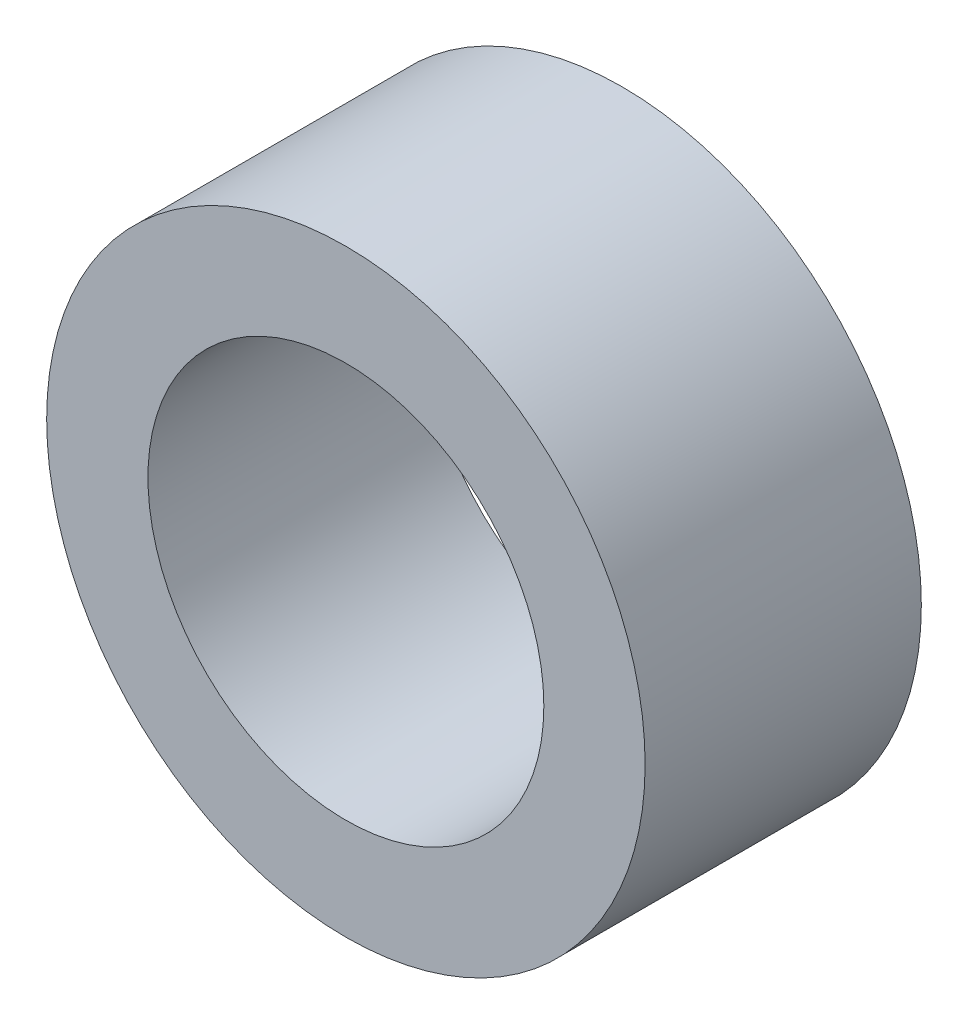
ISO-10303-21;
HEADER;
FILE_DESCRIPTION(('STEP AP214'),'2;1');
FILE_NAME('part.step','',(''),(''),'','','');
FILE_SCHEMA(('AUTOMOTIVE_DESIGN { 1 0 10303 214 1 1 1 1 }'));
ENDSEC;
DATA;
#1=APPLICATION_CONTEXT('core data for automotive mechanical design processes');
#2=APPLICATION_PROTOCOL_DEFINITION('international standard','automotive_design',2000,#1);
#3=PRODUCT_CONTEXT('',#1,'mechanical');
#4=PRODUCT('Part','Part','',(#3));
#5=PRODUCT_RELATED_PRODUCT_CATEGORY('part','',(#4));
#6=PRODUCT_DEFINITION_FORMATION('','',#4);
#7=PRODUCT_DEFINITION_CONTEXT('part definition',#1,'design');
#8=PRODUCT_DEFINITION('design','',#6,#7);
#9=PRODUCT_DEFINITION_SHAPE('','',#8);
#10=(LENGTH_UNIT() NAMED_UNIT(*) SI_UNIT(.MILLI.,.METRE.));
#11=(NAMED_UNIT(*) PLANE_ANGLE_UNIT() SI_UNIT($,.RADIAN.));
#12=(NAMED_UNIT(*) SI_UNIT($,.STERADIAN.) SOLID_ANGLE_UNIT());
#13=UNCERTAINTY_MEASURE_WITH_UNIT(LENGTH_MEASURE(1.E-05),#10,'distance_accuracy_value','');
#14=(GEOMETRIC_REPRESENTATION_CONTEXT(3) GLOBAL_UNCERTAINTY_ASSIGNED_CONTEXT((#13)) GLOBAL_UNIT_ASSIGNED_CONTEXT((#10,
#11,#12)) REPRESENTATION_CONTEXT('',''));
#15=CARTESIAN_POINT('',(0.,0.,0.));
#16=DIRECTION('',(0.,0.,1.));
#17=DIRECTION('',(1.,0.,0.));
#18=AXIS2_PLACEMENT_3D('',#15,#16,#17);
#19=CARTESIAN_POINT('',(0.,0.,3.));
#20=DIRECTION('',(0.,0.,1.));
#21=DIRECTION('',(1.,0.,0.));
#22=AXIS2_PLACEMENT_3D('',#19,#20,#21);
#23=PLANE('',#22);
#24=CARTESIAN_POINT('',(0.,0.,3.));
#25=DIRECTION('',(0.,0.,1.));
#26=DIRECTION('',(1.,0.,0.));
#27=AXIS2_PLACEMENT_3D('',#24,#25,#26);
#28=CIRCLE('',#27,3.25);
#29=CARTESIAN_POINT('',(3.25,0.,3.));
#30=VERTEX_POINT('',#29);
#31=EDGE_CURVE('E10',#30,#30,#28,.T.);
#32=ORIENTED_EDGE('',*,*,#31,.T.);
#33=EDGE_LOOP('',(#32));
#34=FACE_BOUND('',#33,.T.);
#35=CARTESIAN_POINT('',(0.,0.,3.));
#36=DIRECTION('',(0.,0.,1.));
#37=DIRECTION('',(1.,0.,0.));
#38=AXIS2_PLACEMENT_3D('',#35,#36,#37);
#39=CIRCLE('',#38,2.15);
#40=CARTESIAN_POINT('',(2.15,0.,3.));
#41=VERTEX_POINT('',#40);
#42=EDGE_CURVE('E50',#41,#41,#39,.T.);
#43=ORIENTED_EDGE('',*,*,#42,.F.);
#44=EDGE_LOOP('',(#43));
#45=FACE_BOUND('',#44,.T.);
#46=ADVANCED_FACE('F39',(#34,#45),#23,.T.);
#47=CARTESIAN_POINT('',(0.,0.,0.));
#48=DIRECTION('',(0.,0.,1.));
#49=DIRECTION('',(1.,0.,0.));
#50=AXIS2_PLACEMENT_3D('',#47,#48,#49);
#51=PLANE('',#50);
#52=CARTESIAN_POINT('',(0.,0.,0.));
#53=DIRECTION('',(0.,0.,1.));
#54=DIRECTION('',(1.,0.,0.));
#55=AXIS2_PLACEMENT_3D('',#52,#53,#54);
#56=CIRCLE('',#55,3.25);
#57=CARTESIAN_POINT('',(3.25,0.,0.));
#58=VERTEX_POINT('',#57);
#59=EDGE_CURVE('E43',#58,#58,#56,.T.);
#60=ORIENTED_EDGE('',*,*,#59,.F.);
#61=EDGE_LOOP('',(#60));
#62=FACE_BOUND('',#61,.T.);
#63=CARTESIAN_POINT('',(0.,0.,0.));
#64=DIRECTION('',(0.,0.,1.));
#65=DIRECTION('',(1.,0.,0.));
#66=AXIS2_PLACEMENT_3D('',#63,#64,#65);
#67=CIRCLE('',#66,2.15);
#68=CARTESIAN_POINT('',(2.15,0.,0.));
#69=VERTEX_POINT('',#68);
#70=EDGE_CURVE('E52',#69,#69,#67,.T.);
#71=ORIENTED_EDGE('',*,*,#70,.T.);
#72=EDGE_LOOP('',(#71));
#73=FACE_BOUND('',#72,.T.);
#74=ADVANCED_FACE('F62',(#62,#73),#51,.F.);
#75=CARTESIAN_POINT('',(0.,0.,3.));
#76=DIRECTION('',(0.,0.,-1.));
#77=DIRECTION('',(-1.,0.,0.));
#78=AXIS2_PLACEMENT_3D('',#75,#76,#77);
#79=CYLINDRICAL_SURFACE('',#78,3.25);
#80=ORIENTED_EDGE('',*,*,#31,.F.);
#81=EDGE_LOOP('',(#80));
#82=FACE_BOUND('',#81,.T.);
#83=ORIENTED_EDGE('',*,*,#59,.T.);
#84=EDGE_LOOP('',(#83));
#85=FACE_BOUND('',#84,.T.);
#86=ADVANCED_FACE('F41',(#82,#85),#79,.T.);
#87=CARTESIAN_POINT('',(0.,0.,3.));
#88=DIRECTION('',(0.,0.,-1.));
#89=DIRECTION('',(-1.,0.,0.));
#90=AXIS2_PLACEMENT_3D('',#87,#88,#89);
#91=CYLINDRICAL_SURFACE('',#90,2.15);
#92=ORIENTED_EDGE('',*,*,#42,.T.);
#93=EDGE_LOOP('',(#92));
#94=FACE_BOUND('',#93,.T.);
#95=ORIENTED_EDGE('',*,*,#70,.F.);
#96=EDGE_LOOP('',(#95));
#97=FACE_BOUND('',#96,.T.);
#98=ADVANCED_FACE('F58',(#94,#97),#91,.F.);
#99=CLOSED_SHELL('',(#46,#74,#86,#98));
#100=MANIFOLD_SOLID_BREP('B2',#99);
#101=ADVANCED_BREP_SHAPE_REPRESENTATION('',(#18,#100),#14);
#102=SHAPE_DEFINITION_REPRESENTATION(#9,#101);
ENDSEC;
END-ISO-10303-21;
